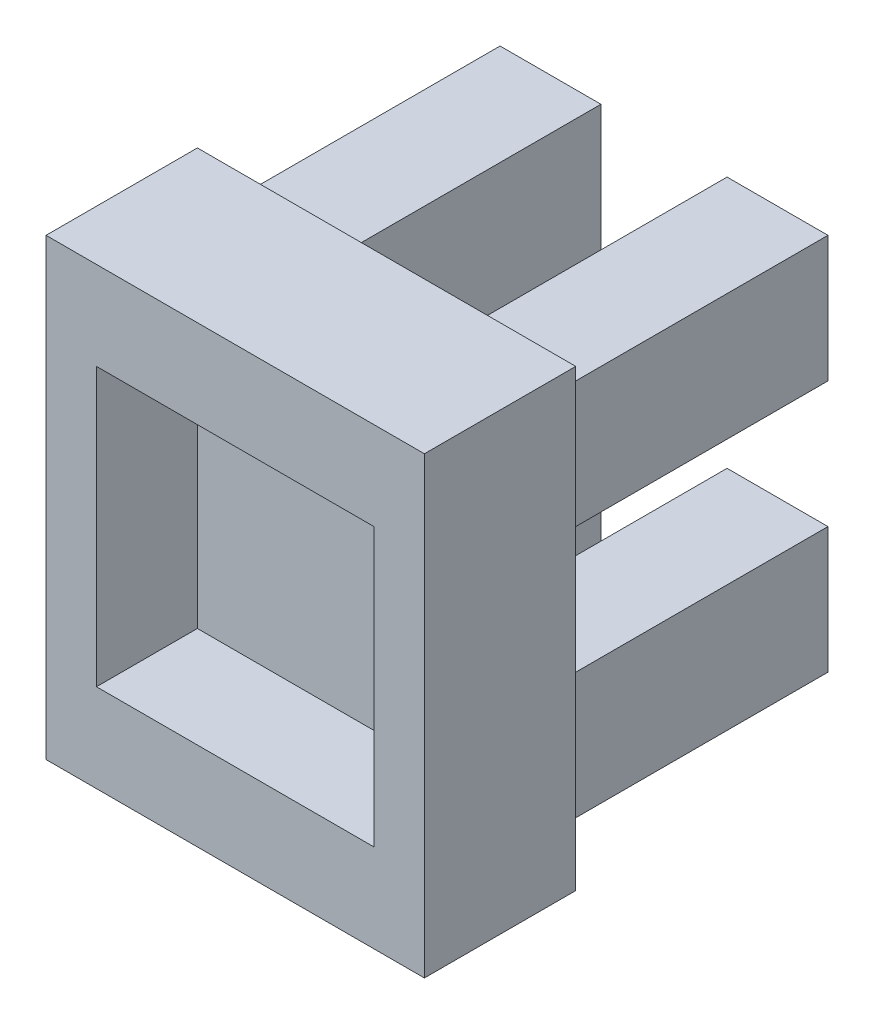
ISO-10303-21;
HEADER;
FILE_DESCRIPTION(('STEP AP214'),'2;1');
FILE_NAME('part.step','',(''),(''),'','','');
FILE_SCHEMA(('AUTOMOTIVE_DESIGN { 1 0 10303 214 1 1 1 1 }'));
ENDSEC;
DATA;
#1=APPLICATION_CONTEXT('core data for automotive mechanical design processes');
#2=APPLICATION_PROTOCOL_DEFINITION('international standard','automotive_design',2000,#1);
#3=PRODUCT_CONTEXT('',#1,'mechanical');
#4=PRODUCT('Part','Part','',(#3));
#5=PRODUCT_RELATED_PRODUCT_CATEGORY('part','',(#4));
#6=PRODUCT_DEFINITION_FORMATION('','',#4);
#7=PRODUCT_DEFINITION_CONTEXT('part definition',#1,'design');
#8=PRODUCT_DEFINITION('design','',#6,#7);
#9=PRODUCT_DEFINITION_SHAPE('','',#8);
#10=(LENGTH_UNIT() NAMED_UNIT(*) SI_UNIT(.MILLI.,.METRE.));
#11=(NAMED_UNIT(*) PLANE_ANGLE_UNIT() SI_UNIT($,.RADIAN.));
#12=(NAMED_UNIT(*) SI_UNIT($,.STERADIAN.) SOLID_ANGLE_UNIT());
#13=UNCERTAINTY_MEASURE_WITH_UNIT(LENGTH_MEASURE(1.E-05),#10,'distance_accuracy_value','');
#14=(GEOMETRIC_REPRESENTATION_CONTEXT(3) GLOBAL_UNCERTAINTY_ASSIGNED_CONTEXT((#13)) GLOBAL_UNIT_ASSIGNED_CONTEXT((#10,
#11,#12)) REPRESENTATION_CONTEXT('',''));
#15=CARTESIAN_POINT('',(0.,0.,0.));
#16=DIRECTION('',(0.,0.,1.));
#17=DIRECTION('',(1.,0.,0.));
#18=AXIS2_PLACEMENT_3D('',#15,#16,#17);
#19=CARTESIAN_POINT('',(0.,0.,0.));
#20=DIRECTION('',(0.,0.,-1.));
#21=DIRECTION('',(-1.,0.,0.));
#22=AXIS2_PLACEMENT_3D('',#19,#20,#21);
#23=PLANE('',#22);
#24=DIRECTION('',(0.,-1.,0.));
#25=VECTOR('',#24,1.);
#26=CARTESIAN_POINT('',(0.,0.,0.));
#27=LINE('',#26,#25);
#28=CARTESIAN_POINT('',(0.,18.,0.));
#29=VERTEX_POINT('',#28);
#30=CARTESIAN_POINT('',(0.,0.,0.));
#31=VERTEX_POINT('',#30);
#32=EDGE_CURVE('E391',#29,#31,#27,.T.);
#33=ORIENTED_EDGE('',*,*,#32,.F.);
#34=DIRECTION('',(-1.,0.,0.));
#35=VECTOR('',#34,1.);
#36=CARTESIAN_POINT('',(0.,18.,0.));
#37=LINE('',#36,#35);
#38=CARTESIAN_POINT('',(15.,18.,0.));
#39=VERTEX_POINT('',#38);
#40=EDGE_CURVE('E406',#39,#29,#37,.T.);
#41=ORIENTED_EDGE('',*,*,#40,.F.);
#42=DIRECTION('',(0.,1.,0.));
#43=VECTOR('',#42,1.);
#44=CARTESIAN_POINT('',(15.,0.,0.));
#45=LINE('',#44,#43);
#46=CARTESIAN_POINT('',(15.,0.,0.));
#47=VERTEX_POINT('',#46);
#48=EDGE_CURVE('E422',#47,#39,#45,.T.);
#49=ORIENTED_EDGE('',*,*,#48,.F.);
#50=DIRECTION('',(1.,0.,0.));
#51=VECTOR('',#50,1.);
#52=CARTESIAN_POINT('',(0.,0.,0.));
#53=LINE('',#52,#51);
#54=EDGE_CURVE('E419',#31,#47,#53,.T.);
#55=ORIENTED_EDGE('',*,*,#54,.F.);
#56=EDGE_LOOP('',(#33,#41,#49,#55));
#57=FACE_BOUND('',#56,.T.);
#58=DIRECTION('',(-1.,0.,0.));
#59=VECTOR('',#58,1.);
#60=CARTESIAN_POINT('',(14.,11.5,0.));
#61=LINE('',#60,#59);
#62=CARTESIAN_POINT('',(14.,11.5,0.));
#63=VERTEX_POINT('',#62);
#64=CARTESIAN_POINT('',(10.,11.5,0.));
#65=VERTEX_POINT('',#64);
#66=EDGE_CURVE('E334',#63,#65,#61,.T.);
#67=ORIENTED_EDGE('',*,*,#66,.F.);
#68=DIRECTION('',(0.,-1.,0.));
#69=VECTOR('',#68,1.);
#70=CARTESIAN_POINT('',(14.,16.5,0.));
#71=LINE('',#70,#69);
#72=CARTESIAN_POINT('',(14.,16.5,0.));
#73=VERTEX_POINT('',#72);
#74=EDGE_CURVE('E315',#73,#63,#71,.T.);
#75=ORIENTED_EDGE('',*,*,#74,.F.);
#76=DIRECTION('',(1.,0.,0.));
#77=VECTOR('',#76,1.);
#78=CARTESIAN_POINT('',(14.,16.5,0.));
#79=LINE('',#78,#77);
#80=CARTESIAN_POINT('',(10.,16.5,0.));
#81=VERTEX_POINT('',#80);
#82=EDGE_CURVE('E321',#81,#73,#79,.T.);
#83=ORIENTED_EDGE('',*,*,#82,.F.);
#84=DIRECTION('',(0.,1.,0.));
#85=VECTOR('',#84,1.);
#86=CARTESIAN_POINT('',(10.,16.5,0.));
#87=LINE('',#86,#85);
#88=EDGE_CURVE('E337',#65,#81,#87,.T.);
#89=ORIENTED_EDGE('',*,*,#88,.F.);
#90=EDGE_LOOP('',(#67,#75,#83,#89));
#91=FACE_BOUND('',#90,.T.);
#92=DIRECTION('',(-1.,0.,0.));
#93=VECTOR('',#92,1.);
#94=CARTESIAN_POINT('',(5.,11.5,0.));
#95=LINE('',#94,#93);
#96=CARTESIAN_POINT('',(5.,11.5,0.));
#97=VERTEX_POINT('',#96);
#98=CARTESIAN_POINT('',(0.999999999999999,11.5,0.));
#99=VERTEX_POINT('',#98);
#100=EDGE_CURVE('E293',#97,#99,#95,.T.);
#101=ORIENTED_EDGE('',*,*,#100,.F.);
#102=DIRECTION('',(0.,-1.,0.));
#103=VECTOR('',#102,1.);
#104=CARTESIAN_POINT('',(5.,16.5,0.));
#105=LINE('',#104,#103);
#106=CARTESIAN_POINT('',(5.,16.5,0.));
#107=VERTEX_POINT('',#106);
#108=EDGE_CURVE('E274',#107,#97,#105,.T.);
#109=ORIENTED_EDGE('',*,*,#108,.F.);
#110=DIRECTION('',(1.,0.,0.));
#111=VECTOR('',#110,1.);
#112=CARTESIAN_POINT('',(5.,16.5,0.));
#113=LINE('',#112,#111);
#114=CARTESIAN_POINT('',(1.,16.5,0.));
#115=VERTEX_POINT('',#114);
#116=EDGE_CURVE('E280',#115,#107,#113,.T.);
#117=ORIENTED_EDGE('',*,*,#116,.F.);
#118=DIRECTION('',(0.,1.,0.));
#119=VECTOR('',#118,1.);
#120=CARTESIAN_POINT('',(1.,16.5,0.));
#121=LINE('',#120,#119);
#122=EDGE_CURVE('E296',#99,#115,#121,.T.);
#123=ORIENTED_EDGE('',*,*,#122,.F.);
#124=EDGE_LOOP('',(#101,#109,#117,#123));
#125=FACE_BOUND('',#124,.T.);
#126=DIRECTION('',(-1.,0.,0.));
#127=VECTOR('',#126,1.);
#128=CARTESIAN_POINT('',(14.,1.5,0.));
#129=LINE('',#128,#127);
#130=CARTESIAN_POINT('',(14.,1.5,0.));
#131=VERTEX_POINT('',#130);
#132=CARTESIAN_POINT('',(10.,1.5,0.));
#133=VERTEX_POINT('',#132);
#134=EDGE_CURVE('E235',#131,#133,#129,.T.);
#135=ORIENTED_EDGE('',*,*,#134,.F.);
#136=DIRECTION('',(0.,-1.,0.));
#137=VECTOR('',#136,1.);
#138=CARTESIAN_POINT('',(14.,6.5,0.));
#139=LINE('',#138,#137);
#140=CARTESIAN_POINT('',(14.,6.5,0.));
#141=VERTEX_POINT('',#140);
#142=EDGE_CURVE('E230',#141,#131,#139,.T.);
#143=ORIENTED_EDGE('',*,*,#142,.F.);
#144=DIRECTION('',(1.,0.,0.));
#145=VECTOR('',#144,1.);
#146=CARTESIAN_POINT('',(14.,6.5,0.));
#147=LINE('',#146,#145);
#148=CARTESIAN_POINT('',(10.,6.5,0.));
#149=VERTEX_POINT('',#148);
#150=EDGE_CURVE('E245',#149,#141,#147,.T.);
#151=ORIENTED_EDGE('',*,*,#150,.F.);
#152=DIRECTION('',(0.,1.,0.));
#153=VECTOR('',#152,1.);
#154=CARTESIAN_POINT('',(10.,6.5,0.));
#155=LINE('',#154,#153);
#156=EDGE_CURVE('E257',#133,#149,#155,.T.);
#157=ORIENTED_EDGE('',*,*,#156,.F.);
#158=EDGE_LOOP('',(#135,#143,#151,#157));
#159=FACE_BOUND('',#158,.T.);
#160=DIRECTION('',(-1.,0.,0.));
#161=VECTOR('',#160,1.);
#162=CARTESIAN_POINT('',(5.,1.5,0.));
#163=LINE('',#162,#161);
#164=CARTESIAN_POINT('',(5.,1.5,0.));
#165=VERTEX_POINT('',#164);
#166=CARTESIAN_POINT('',(0.999999999999997,1.5,0.));
#167=VERTEX_POINT('',#166);
#168=EDGE_CURVE('E726',#165,#167,#163,.T.);
#169=ORIENTED_EDGE('',*,*,#168,.F.);
#170=DIRECTION('',(0.,-1.,0.));
#171=VECTOR('',#170,1.);
#172=CARTESIAN_POINT('',(5.,6.5,0.));
#173=LINE('',#172,#171);
#174=CARTESIAN_POINT('',(5.,6.5,0.));
#175=VERTEX_POINT('',#174);
#176=EDGE_CURVE('E227',#175,#165,#173,.T.);
#177=ORIENTED_EDGE('',*,*,#176,.F.);
#178=DIRECTION('',(1.,0.,0.));
#179=VECTOR('',#178,1.);
#180=CARTESIAN_POINT('',(5.,6.5,0.));
#181=LINE('',#180,#179);
#182=CARTESIAN_POINT('',(0.999999999999998,6.5,0.));
#183=VERTEX_POINT('',#182);
#184=EDGE_CURVE('E223',#183,#175,#181,.T.);
#185=ORIENTED_EDGE('',*,*,#184,.F.);
#186=DIRECTION('',(0.,1.,0.));
#187=VECTOR('',#186,1.);
#188=CARTESIAN_POINT('',(0.999999999999998,6.5,0.));
#189=LINE('',#188,#187);
#190=EDGE_CURVE('E722',#167,#183,#189,.T.);
#191=ORIENTED_EDGE('',*,*,#190,.F.);
#192=EDGE_LOOP('',(#169,#177,#185,#191));
#193=FACE_BOUND('',#192,.T.);
#194=ADVANCED_FACE('F39',(#57,#91,#125,#159,#193),#23,.T.);
#195=CARTESIAN_POINT('',(0.,0.,6.));
#196=DIRECTION('',(1.,0.,0.));
#197=DIRECTION('',(0.,0.,-1.));
#198=AXIS2_PLACEMENT_3D('',#195,#196,#197);
#199=PLANE('',#198);
#200=ORIENTED_EDGE('',*,*,#32,.T.);
#201=DIRECTION('',(0.,0.,-1.));
#202=VECTOR('',#201,1.);
#203=CARTESIAN_POINT('',(0.,0.,6.));
#204=LINE('',#203,#202);
#205=CARTESIAN_POINT('',(0.,0.,6.));
#206=VERTEX_POINT('',#205);
#207=EDGE_CURVE('E11',#206,#31,#204,.T.);
#208=ORIENTED_EDGE('',*,*,#207,.F.);
#209=DIRECTION('',(0.,-1.,0.));
#210=VECTOR('',#209,1.);
#211=CARTESIAN_POINT('',(0.,0.,6.));
#212=LINE('',#211,#210);
#213=CARTESIAN_POINT('',(0.,18.,6.));
#214=VERTEX_POINT('',#213);
#215=EDGE_CURVE('E401',#214,#206,#212,.T.);
#216=ORIENTED_EDGE('',*,*,#215,.F.);
#217=DIRECTION('',(0.,0.,-1.));
#218=VECTOR('',#217,1.);
#219=CARTESIAN_POINT('',(0.,18.,6.));
#220=LINE('',#219,#218);
#221=EDGE_CURVE('E415',#214,#29,#220,.T.);
#222=ORIENTED_EDGE('',*,*,#221,.T.);
#223=EDGE_LOOP('',(#200,#208,#216,#222));
#224=FACE_BOUND('',#223,.T.);
#225=ADVANCED_FACE('F41',(#224),#199,.F.);
#226=CARTESIAN_POINT('',(0.,0.,6.));
#227=DIRECTION('',(0.,1.,0.));
#228=DIRECTION('',(0.,0.,1.));
#229=AXIS2_PLACEMENT_3D('',#226,#227,#228);
#230=PLANE('',#229);
#231=ORIENTED_EDGE('',*,*,#54,.T.);
#232=DIRECTION('',(0.,0.,-1.));
#233=VECTOR('',#232,1.);
#234=CARTESIAN_POINT('',(15.,0.,6.));
#235=LINE('',#234,#233);
#236=CARTESIAN_POINT('',(15.,0.,6.));
#237=VERTEX_POINT('',#236);
#238=EDGE_CURVE('E48',#237,#47,#235,.T.);
#239=ORIENTED_EDGE('',*,*,#238,.F.);
#240=DIRECTION('',(1.,0.,0.));
#241=VECTOR('',#240,1.);
#242=CARTESIAN_POINT('',(0.,0.,6.));
#243=LINE('',#242,#241);
#244=EDGE_CURVE('E405',#206,#237,#243,.T.);
#245=ORIENTED_EDGE('',*,*,#244,.F.);
#246=ORIENTED_EDGE('',*,*,#207,.T.);
#247=EDGE_LOOP('',(#231,#239,#245,#246));
#248=FACE_BOUND('',#247,.T.);
#249=ADVANCED_FACE('F455',(#248),#230,.F.);
#250=CARTESIAN_POINT('',(15.,0.,6.));
#251=DIRECTION('',(-1.,0.,0.));
#252=DIRECTION('',(0.,0.,1.));
#253=AXIS2_PLACEMENT_3D('',#250,#251,#252);
#254=PLANE('',#253);
#255=ORIENTED_EDGE('',*,*,#48,.T.);
#256=DIRECTION('',(0.,0.,-1.));
#257=VECTOR('',#256,1.);
#258=CARTESIAN_POINT('',(15.,18.,6.));
#259=LINE('',#258,#257);
#260=CARTESIAN_POINT('',(15.,18.,6.));
#261=VERTEX_POINT('',#260);
#262=EDGE_CURVE('E430',#261,#39,#259,.T.);
#263=ORIENTED_EDGE('',*,*,#262,.F.);
#264=DIRECTION('',(0.,1.,0.));
#265=VECTOR('',#264,1.);
#266=CARTESIAN_POINT('',(15.,0.,6.));
#267=LINE('',#266,#265);
#268=EDGE_CURVE('E409',#237,#261,#267,.T.);
#269=ORIENTED_EDGE('',*,*,#268,.F.);
#270=ORIENTED_EDGE('',*,*,#238,.T.);
#271=EDGE_LOOP('',(#255,#263,#269,#270));
#272=FACE_BOUND('',#271,.T.);
#273=ADVANCED_FACE('F439',(#272),#254,.F.);
#274=CARTESIAN_POINT('',(0.,18.,6.));
#275=DIRECTION('',(0.,-1.,0.));
#276=DIRECTION('',(0.,0.,-1.));
#277=AXIS2_PLACEMENT_3D('',#274,#275,#276);
#278=PLANE('',#277);
#279=ORIENTED_EDGE('',*,*,#40,.T.);
#280=ORIENTED_EDGE('',*,*,#221,.F.);
#281=DIRECTION('',(-1.,0.,0.));
#282=VECTOR('',#281,1.);
#283=CARTESIAN_POINT('',(0.,18.,6.));
#284=LINE('',#283,#282);
#285=EDGE_CURVE('E412',#261,#214,#284,.T.);
#286=ORIENTED_EDGE('',*,*,#285,.F.);
#287=ORIENTED_EDGE('',*,*,#262,.T.);
#288=EDGE_LOOP('',(#279,#280,#286,#287));
#289=FACE_BOUND('',#288,.T.);
#290=ADVANCED_FACE('F448',(#289),#278,.F.);
#291=CARTESIAN_POINT('',(0.,0.,6.));
#292=DIRECTION('',(0.,0.,-1.));
#293=DIRECTION('',(-1.,0.,0.));
#294=AXIS2_PLACEMENT_3D('',#291,#292,#293);
#295=PLANE('',#294);
#296=DIRECTION('',(1.,0.,0.));
#297=VECTOR('',#296,1.);
#298=CARTESIAN_POINT('',(2.,3.5,6.));
#299=LINE('',#298,#297);
#300=CARTESIAN_POINT('',(2.,3.5,6.));
#301=VERTEX_POINT('',#300);
#302=CARTESIAN_POINT('',(13.,3.5,6.));
#303=VERTEX_POINT('',#302);
#304=EDGE_CURVE('E377',#301,#303,#299,.T.);
#305=ORIENTED_EDGE('',*,*,#304,.F.);
#306=DIRECTION('',(0.,-1.,0.));
#307=VECTOR('',#306,1.);
#308=CARTESIAN_POINT('',(2.,14.5,6.));
#309=LINE('',#308,#307);
#310=CARTESIAN_POINT('',(2.,14.5,6.));
#311=VERTEX_POINT('',#310);
#312=EDGE_CURVE('E356',#311,#301,#309,.T.);
#313=ORIENTED_EDGE('',*,*,#312,.F.);
#314=DIRECTION('',(-1.,0.,0.));
#315=VECTOR('',#314,1.);
#316=CARTESIAN_POINT('',(2.,14.5,6.));
#317=LINE('',#316,#315);
#318=CARTESIAN_POINT('',(13.,14.5,6.));
#319=VERTEX_POINT('',#318);
#320=EDGE_CURVE('E362',#319,#311,#317,.T.);
#321=ORIENTED_EDGE('',*,*,#320,.F.);
#322=DIRECTION('',(0.,1.,0.));
#323=VECTOR('',#322,1.);
#324=CARTESIAN_POINT('',(13.,14.5,6.));
#325=LINE('',#324,#323);
#326=EDGE_CURVE('E381',#303,#319,#325,.T.);
#327=ORIENTED_EDGE('',*,*,#326,.F.);
#328=EDGE_LOOP('',(#305,#313,#321,#327));
#329=FACE_BOUND('',#328,.T.);
#330=ORIENTED_EDGE('',*,*,#215,.T.);
#331=ORIENTED_EDGE('',*,*,#244,.T.);
#332=ORIENTED_EDGE('',*,*,#268,.T.);
#333=ORIENTED_EDGE('',*,*,#285,.T.);
#334=EDGE_LOOP('',(#330,#331,#332,#333));
#335=FACE_BOUND('',#334,.T.);
#336=ADVANCED_FACE('F454',(#329,#335),#295,.F.);
#337=CARTESIAN_POINT('',(2.,14.5,2.));
#338=DIRECTION('',(-1.,0.,0.));
#339=DIRECTION('',(0.,-1.,0.));
#340=AXIS2_PLACEMENT_3D('',#337,#338,#339);
#341=PLANE('',#340);
#342=ORIENTED_EDGE('',*,*,#312,.T.);
#343=DIRECTION('',(0.,0.,1.));
#344=VECTOR('',#343,1.);
#345=CARTESIAN_POINT('',(2.,3.5,2.));
#346=LINE('',#345,#344);
#347=CARTESIAN_POINT('',(2.,3.5,2.));
#348=VERTEX_POINT('',#347);
#349=EDGE_CURVE('E374',#348,#301,#346,.T.);
#350=ORIENTED_EDGE('',*,*,#349,.F.);
#351=DIRECTION('',(0.,-1.,0.));
#352=VECTOR('',#351,1.);
#353=CARTESIAN_POINT('',(2.,14.5,2.));
#354=LINE('',#353,#352);
#355=CARTESIAN_POINT('',(2.,14.5,2.));
#356=VERTEX_POINT('',#355);
#357=EDGE_CURVE('E357',#356,#348,#354,.T.);
#358=ORIENTED_EDGE('',*,*,#357,.F.);
#359=DIRECTION('',(0.,0.,1.));
#360=VECTOR('',#359,1.);
#361=CARTESIAN_POINT('',(2.,14.5,2.));
#362=LINE('',#361,#360);
#363=EDGE_CURVE('E388',#356,#311,#362,.T.);
#364=ORIENTED_EDGE('',*,*,#363,.T.);
#365=EDGE_LOOP('',(#342,#350,#358,#364));
#366=FACE_BOUND('',#365,.T.);
#367=ADVANCED_FACE('F473',(#366),#341,.F.);
#368=CARTESIAN_POINT('',(2.,14.5,2.));
#369=DIRECTION('',(0.,1.,0.));
#370=DIRECTION('',(0.,0.,1.));
#371=AXIS2_PLACEMENT_3D('',#368,#369,#370);
#372=PLANE('',#371);
#373=ORIENTED_EDGE('',*,*,#320,.T.);
#374=ORIENTED_EDGE('',*,*,#363,.F.);
#375=DIRECTION('',(-1.,0.,0.));
#376=VECTOR('',#375,1.);
#377=CARTESIAN_POINT('',(2.,14.5,2.));
#378=LINE('',#377,#376);
#379=CARTESIAN_POINT('',(13.,14.5,2.));
#380=VERTEX_POINT('',#379);
#381=EDGE_CURVE('E370',#380,#356,#378,.T.);
#382=ORIENTED_EDGE('',*,*,#381,.F.);
#383=DIRECTION('',(0.,0.,1.));
#384=VECTOR('',#383,1.);
#385=CARTESIAN_POINT('',(13.,14.5,2.));
#386=LINE('',#385,#384);
#387=EDGE_CURVE('E392',#380,#319,#386,.T.);
#388=ORIENTED_EDGE('',*,*,#387,.T.);
#389=EDGE_LOOP('',(#373,#374,#382,#388));
#390=FACE_BOUND('',#389,.T.);
#391=ADVANCED_FACE('F478',(#390),#372,.F.);
#392=CARTESIAN_POINT('',(13.,14.5,2.));
#393=DIRECTION('',(1.,0.,0.));
#394=DIRECTION('',(0.,1.,0.));
#395=AXIS2_PLACEMENT_3D('',#392,#393,#394);
#396=PLANE('',#395);
#397=ORIENTED_EDGE('',*,*,#326,.T.);
#398=ORIENTED_EDGE('',*,*,#387,.F.);
#399=DIRECTION('',(0.,1.,0.));
#400=VECTOR('',#399,1.);
#401=CARTESIAN_POINT('',(13.,14.5,2.));
#402=LINE('',#401,#400);
#403=CARTESIAN_POINT('',(13.,3.5,2.));
#404=VERTEX_POINT('',#403);
#405=EDGE_CURVE('E366',#404,#380,#402,.T.);
#406=ORIENTED_EDGE('',*,*,#405,.F.);
#407=DIRECTION('',(0.,0.,1.));
#408=VECTOR('',#407,1.);
#409=CARTESIAN_POINT('',(13.,3.5,2.));
#410=LINE('',#409,#408);
#411=EDGE_CURVE('E395',#404,#303,#410,.T.);
#412=ORIENTED_EDGE('',*,*,#411,.T.);
#413=EDGE_LOOP('',(#397,#398,#406,#412));
#414=FACE_BOUND('',#413,.T.);
#415=ADVANCED_FACE('F492',(#414),#396,.F.);
#416=CARTESIAN_POINT('',(2.,3.5,2.));
#417=DIRECTION('',(0.,-1.,0.));
#418=DIRECTION('',(0.,0.,-1.));
#419=AXIS2_PLACEMENT_3D('',#416,#417,#418);
#420=PLANE('',#419);
#421=ORIENTED_EDGE('',*,*,#304,.T.);
#422=ORIENTED_EDGE('',*,*,#411,.F.);
#423=DIRECTION('',(1.,0.,0.));
#424=VECTOR('',#423,1.);
#425=CARTESIAN_POINT('',(2.,3.5,2.));
#426=LINE('',#425,#424);
#427=EDGE_CURVE('E361',#348,#404,#426,.T.);
#428=ORIENTED_EDGE('',*,*,#427,.F.);
#429=ORIENTED_EDGE('',*,*,#349,.T.);
#430=EDGE_LOOP('',(#421,#422,#428,#429));
#431=FACE_BOUND('',#430,.T.);
#432=ADVANCED_FACE('F485',(#431),#420,.F.);
#433=CARTESIAN_POINT('',(0.,0.,2.));
#434=DIRECTION('',(0.,0.,1.));
#435=DIRECTION('',(1.,0.,0.));
#436=AXIS2_PLACEMENT_3D('',#433,#434,#435);
#437=PLANE('',#436);
#438=ORIENTED_EDGE('',*,*,#357,.T.);
#439=ORIENTED_EDGE('',*,*,#427,.T.);
#440=ORIENTED_EDGE('',*,*,#405,.T.);
#441=ORIENTED_EDGE('',*,*,#381,.T.);
#442=EDGE_LOOP('',(#438,#439,#440,#441));
#443=FACE_BOUND('',#442,.T.);
#444=ADVANCED_FACE('F494',(#443),#437,.T.);
#445=CARTESIAN_POINT('',(14.,16.5,-11.));
#446=DIRECTION('',(-1.,0.,0.));
#447=DIRECTION('',(0.,0.,1.));
#448=AXIS2_PLACEMENT_3D('',#445,#446,#447);
#449=PLANE('',#448);
#450=ORIENTED_EDGE('',*,*,#74,.T.);
#451=DIRECTION('',(0.,0.,1.));
#452=VECTOR('',#451,1.);
#453=CARTESIAN_POINT('',(14.,11.5,-11.));
#454=LINE('',#453,#452);
#455=CARTESIAN_POINT('',(14.,11.5,-11.));
#456=VERTEX_POINT('',#455);
#457=EDGE_CURVE('E353',#456,#63,#454,.T.);
#458=ORIENTED_EDGE('',*,*,#457,.F.);
#459=DIRECTION('',(0.,-1.,0.));
#460=VECTOR('',#459,1.);
#461=CARTESIAN_POINT('',(14.,16.5,-11.));
#462=LINE('',#461,#460);
#463=CARTESIAN_POINT('',(14.,16.5,-11.));
#464=VERTEX_POINT('',#463);
#465=EDGE_CURVE('E316',#464,#456,#462,.T.);
#466=ORIENTED_EDGE('',*,*,#465,.F.);
#467=DIRECTION('',(0.,0.,1.));
#468=VECTOR('',#467,1.);
#469=CARTESIAN_POINT('',(14.,16.5,-11.));
#470=LINE('',#469,#468);
#471=EDGE_CURVE('E330',#464,#73,#470,.T.);
#472=ORIENTED_EDGE('',*,*,#471,.T.);
#473=EDGE_LOOP('',(#450,#458,#466,#472));
#474=FACE_BOUND('',#473,.T.);
#475=ADVANCED_FACE('F496',(#474),#449,.F.);
#476=CARTESIAN_POINT('',(14.,11.5,-11.));
#477=DIRECTION('',(0.,1.,0.));
#478=DIRECTION('',(0.,0.,1.));
#479=AXIS2_PLACEMENT_3D('',#476,#477,#478);
#480=PLANE('',#479);
#481=ORIENTED_EDGE('',*,*,#66,.T.);
#482=DIRECTION('',(0.,0.,1.));
#483=VECTOR('',#482,1.);
#484=CARTESIAN_POINT('',(10.,11.5,-11.));
#485=LINE('',#484,#483);
#486=CARTESIAN_POINT('',(10.,11.5,-11.));
#487=VERTEX_POINT('',#486);
#488=EDGE_CURVE('E349',#487,#65,#485,.T.);
#489=ORIENTED_EDGE('',*,*,#488,.F.);
#490=DIRECTION('',(-1.,0.,0.));
#491=VECTOR('',#490,1.);
#492=CARTESIAN_POINT('',(14.,11.5,-11.));
#493=LINE('',#492,#491);
#494=EDGE_CURVE('E320',#456,#487,#493,.T.);
#495=ORIENTED_EDGE('',*,*,#494,.F.);
#496=ORIENTED_EDGE('',*,*,#457,.T.);
#497=EDGE_LOOP('',(#481,#489,#495,#496));
#498=FACE_BOUND('',#497,.T.);
#499=ADVANCED_FACE('F502',(#498),#480,.F.);
#500=CARTESIAN_POINT('',(10.,16.5,-11.));
#501=DIRECTION('',(1.,0.,0.));
#502=DIRECTION('',(0.,1.,0.));
#503=AXIS2_PLACEMENT_3D('',#500,#501,#502);
#504=PLANE('',#503);
#505=ORIENTED_EDGE('',*,*,#88,.T.);
#506=DIRECTION('',(0.,0.,1.));
#507=VECTOR('',#506,1.);
#508=CARTESIAN_POINT('',(10.,16.5,-11.));
#509=LINE('',#508,#507);
#510=CARTESIAN_POINT('',(10.,16.5,-11.));
#511=VERTEX_POINT('',#510);
#512=EDGE_CURVE('E346',#511,#81,#509,.T.);
#513=ORIENTED_EDGE('',*,*,#512,.F.);
#514=DIRECTION('',(0.,1.,0.));
#515=VECTOR('',#514,1.);
#516=CARTESIAN_POINT('',(10.,16.5,-11.));
#517=LINE('',#516,#515);
#518=EDGE_CURVE('E324',#487,#511,#517,.T.);
#519=ORIENTED_EDGE('',*,*,#518,.F.);
#520=ORIENTED_EDGE('',*,*,#488,.T.);
#521=EDGE_LOOP('',(#505,#513,#519,#520));
#522=FACE_BOUND('',#521,.T.);
#523=ADVANCED_FACE('F542',(#522),#504,.F.);
#524=CARTESIAN_POINT('',(14.,16.5,-11.));
#525=DIRECTION('',(0.,-1.,0.));
#526=DIRECTION('',(0.,0.,-1.));
#527=AXIS2_PLACEMENT_3D('',#524,#525,#526);
#528=PLANE('',#527);
#529=ORIENTED_EDGE('',*,*,#82,.T.);
#530=ORIENTED_EDGE('',*,*,#471,.F.);
#531=DIRECTION('',(1.,0.,0.));
#532=VECTOR('',#531,1.);
#533=CARTESIAN_POINT('',(14.,16.5,-11.));
#534=LINE('',#533,#532);
#535=EDGE_CURVE('E327',#511,#464,#534,.T.);
#536=ORIENTED_EDGE('',*,*,#535,.F.);
#537=ORIENTED_EDGE('',*,*,#512,.T.);
#538=EDGE_LOOP('',(#529,#530,#536,#537));
#539=FACE_BOUND('',#538,.T.);
#540=ADVANCED_FACE('F551',(#539),#528,.F.);
#541=CARTESIAN_POINT('',(0.,0.,-11.));
#542=DIRECTION('',(0.,0.,-1.));
#543=DIRECTION('',(-1.,0.,0.));
#544=AXIS2_PLACEMENT_3D('',#541,#542,#543);
#545=PLANE('',#544);
#546=ORIENTED_EDGE('',*,*,#465,.T.);
#547=ORIENTED_EDGE('',*,*,#494,.T.);
#548=ORIENTED_EDGE('',*,*,#518,.T.);
#549=ORIENTED_EDGE('',*,*,#535,.T.);
#550=EDGE_LOOP('',(#546,#547,#548,#549));
#551=FACE_BOUND('',#550,.T.);
#552=ADVANCED_FACE('F561',(#551),#545,.T.);
#553=CARTESIAN_POINT('',(5.,16.5,-11.));
#554=DIRECTION('',(-1.,0.,0.));
#555=DIRECTION('',(0.,-1.,0.));
#556=AXIS2_PLACEMENT_3D('',#553,#554,#555);
#557=PLANE('',#556);
#558=ORIENTED_EDGE('',*,*,#108,.T.);
#559=DIRECTION('',(0.,0.,1.));
#560=VECTOR('',#559,1.);
#561=CARTESIAN_POINT('',(5.,11.5,-11.));
#562=LINE('',#561,#560);
#563=CARTESIAN_POINT('',(5.,11.5,-11.));
#564=VERTEX_POINT('',#563);
#565=EDGE_CURVE('E312',#564,#97,#562,.T.);
#566=ORIENTED_EDGE('',*,*,#565,.F.);
#567=DIRECTION('',(0.,-1.,0.));
#568=VECTOR('',#567,1.);
#569=CARTESIAN_POINT('',(5.,16.5,-11.));
#570=LINE('',#569,#568);
#571=CARTESIAN_POINT('',(5.,16.5,-11.));
#572=VERTEX_POINT('',#571);
#573=EDGE_CURVE('E275',#572,#564,#570,.T.);
#574=ORIENTED_EDGE('',*,*,#573,.F.);
#575=DIRECTION('',(0.,0.,1.));
#576=VECTOR('',#575,1.);
#577=CARTESIAN_POINT('',(5.,16.5,-11.));
#578=LINE('',#577,#576);
#579=EDGE_CURVE('E289',#572,#107,#578,.T.);
#580=ORIENTED_EDGE('',*,*,#579,.T.);
#581=EDGE_LOOP('',(#558,#566,#574,#580));
#582=FACE_BOUND('',#581,.T.);
#583=ADVANCED_FACE('F571',(#582),#557,.F.);
#584=CARTESIAN_POINT('',(5.,11.5,-11.));
#585=DIRECTION('',(0.,1.,0.));
#586=DIRECTION('',(-1.,0.,0.));
#587=AXIS2_PLACEMENT_3D('',#584,#585,#586);
#588=PLANE('',#587);
#589=ORIENTED_EDGE('',*,*,#100,.T.);
#590=DIRECTION('',(0.,0.,1.));
#591=VECTOR('',#590,1.);
#592=CARTESIAN_POINT('',(0.999999999999999,11.5,-11.));
#593=LINE('',#592,#591);
#594=CARTESIAN_POINT('',(0.999999999999999,11.5,-11.));
#595=VERTEX_POINT('',#594);
#596=EDGE_CURVE('E308',#595,#99,#593,.T.);
#597=ORIENTED_EDGE('',*,*,#596,.F.);
#598=DIRECTION('',(-1.,0.,0.));
#599=VECTOR('',#598,1.);
#600=CARTESIAN_POINT('',(5.,11.5,-11.));
#601=LINE('',#600,#599);
#602=EDGE_CURVE('E279',#564,#595,#601,.T.);
#603=ORIENTED_EDGE('',*,*,#602,.F.);
#604=ORIENTED_EDGE('',*,*,#565,.T.);
#605=EDGE_LOOP('',(#589,#597,#603,#604));
#606=FACE_BOUND('',#605,.T.);
#607=ADVANCED_FACE('F581',(#606),#588,.F.);
#608=CARTESIAN_POINT('',(1.,16.5,-11.));
#609=DIRECTION('',(1.,0.,0.));
#610=DIRECTION('',(0.,1.,0.));
#611=AXIS2_PLACEMENT_3D('',#608,#609,#610);
#612=PLANE('',#611);
#613=ORIENTED_EDGE('',*,*,#122,.T.);
#614=DIRECTION('',(0.,0.,1.));
#615=VECTOR('',#614,1.);
#616=CARTESIAN_POINT('',(1.,16.5,-11.));
#617=LINE('',#616,#615);
#618=CARTESIAN_POINT('',(1.,16.5,-11.));
#619=VERTEX_POINT('',#618);
#620=EDGE_CURVE('E305',#619,#115,#617,.T.);
#621=ORIENTED_EDGE('',*,*,#620,.F.);
#622=DIRECTION('',(0.,1.,0.));
#623=VECTOR('',#622,1.);
#624=CARTESIAN_POINT('',(1.,16.5,-11.));
#625=LINE('',#624,#623);
#626=EDGE_CURVE('E283',#595,#619,#625,.T.);
#627=ORIENTED_EDGE('',*,*,#626,.F.);
#628=ORIENTED_EDGE('',*,*,#596,.T.);
#629=EDGE_LOOP('',(#613,#621,#627,#628));
#630=FACE_BOUND('',#629,.T.);
#631=ADVANCED_FACE('F591',(#630),#612,.F.);
#632=CARTESIAN_POINT('',(5.,16.5,-11.));
#633=DIRECTION('',(0.,-1.,0.));
#634=DIRECTION('',(0.,0.,-1.));
#635=AXIS2_PLACEMENT_3D('',#632,#633,#634);
#636=PLANE('',#635);
#637=ORIENTED_EDGE('',*,*,#116,.T.);
#638=ORIENTED_EDGE('',*,*,#579,.F.);
#639=DIRECTION('',(1.,0.,0.));
#640=VECTOR('',#639,1.);
#641=CARTESIAN_POINT('',(5.,16.5,-11.));
#642=LINE('',#641,#640);
#643=EDGE_CURVE('E286',#619,#572,#642,.T.);
#644=ORIENTED_EDGE('',*,*,#643,.F.);
#645=ORIENTED_EDGE('',*,*,#620,.T.);
#646=EDGE_LOOP('',(#637,#638,#644,#645));
#647=FACE_BOUND('',#646,.T.);
#648=ADVANCED_FACE('F601',(#647),#636,.F.);
#649=CARTESIAN_POINT('',(0.,0.,-11.));
#650=DIRECTION('',(0.,0.,-1.));
#651=DIRECTION('',(-1.,0.,0.));
#652=AXIS2_PLACEMENT_3D('',#649,#650,#651);
#653=PLANE('',#652);
#654=ORIENTED_EDGE('',*,*,#573,.T.);
#655=ORIENTED_EDGE('',*,*,#602,.T.);
#656=ORIENTED_EDGE('',*,*,#626,.T.);
#657=ORIENTED_EDGE('',*,*,#643,.T.);
#658=EDGE_LOOP('',(#654,#655,#656,#657));
#659=FACE_BOUND('',#658,.T.);
#660=ADVANCED_FACE('F611',(#659),#653,.T.);
#661=CARTESIAN_POINT('',(14.,6.5,-11.));
#662=DIRECTION('',(-1.,0.,0.));
#663=DIRECTION('',(0.,0.,1.));
#664=AXIS2_PLACEMENT_3D('',#661,#662,#663);
#665=PLANE('',#664);
#666=ORIENTED_EDGE('',*,*,#142,.T.);
#667=DIRECTION('',(0.,0.,1.));
#668=VECTOR('',#667,1.);
#669=CARTESIAN_POINT('',(14.,1.5,-11.));
#670=LINE('',#669,#668);
#671=CARTESIAN_POINT('',(14.,1.5,-11.));
#672=VERTEX_POINT('',#671);
#673=EDGE_CURVE('E271',#672,#131,#670,.T.);
#674=ORIENTED_EDGE('',*,*,#673,.F.);
#675=DIRECTION('',(0.,-1.,0.));
#676=VECTOR('',#675,1.);
#677=CARTESIAN_POINT('',(14.,6.5,-11.));
#678=LINE('',#677,#676);
#679=CARTESIAN_POINT('',(14.,6.5,-11.));
#680=VERTEX_POINT('',#679);
#681=EDGE_CURVE('E240',#680,#672,#678,.T.);
#682=ORIENTED_EDGE('',*,*,#681,.F.);
#683=DIRECTION('',(0.,0.,1.));
#684=VECTOR('',#683,1.);
#685=CARTESIAN_POINT('',(14.,6.5,-11.));
#686=LINE('',#685,#684);
#687=EDGE_CURVE('E253',#680,#141,#686,.T.);
#688=ORIENTED_EDGE('',*,*,#687,.T.);
#689=EDGE_LOOP('',(#666,#674,#682,#688));
#690=FACE_BOUND('',#689,.T.);
#691=ADVANCED_FACE('F621',(#690),#665,.F.);
#692=CARTESIAN_POINT('',(14.,1.5,-11.));
#693=DIRECTION('',(0.,1.,0.));
#694=DIRECTION('',(-1.,0.,0.));
#695=AXIS2_PLACEMENT_3D('',#692,#693,#694);
#696=PLANE('',#695);
#697=ORIENTED_EDGE('',*,*,#134,.T.);
#698=DIRECTION('',(0.,0.,1.));
#699=VECTOR('',#698,1.);
#700=CARTESIAN_POINT('',(10.,1.5,-11.));
#701=LINE('',#700,#699);
#702=CARTESIAN_POINT('',(10.,1.5,-11.));
#703=VERTEX_POINT('',#702);
#704=EDGE_CURVE('E267',#703,#133,#701,.T.);
#705=ORIENTED_EDGE('',*,*,#704,.F.);
#706=DIRECTION('',(-1.,0.,0.));
#707=VECTOR('',#706,1.);
#708=CARTESIAN_POINT('',(14.,1.5,-11.));
#709=LINE('',#708,#707);
#710=EDGE_CURVE('E244',#672,#703,#709,.T.);
#711=ORIENTED_EDGE('',*,*,#710,.F.);
#712=ORIENTED_EDGE('',*,*,#673,.T.);
#713=EDGE_LOOP('',(#697,#705,#711,#712));
#714=FACE_BOUND('',#713,.T.);
#715=ADVANCED_FACE('F631',(#714),#696,.F.);
#716=CARTESIAN_POINT('',(10.,6.5,-11.));
#717=DIRECTION('',(1.,0.,0.));
#718=DIRECTION('',(0.,0.,-1.));
#719=AXIS2_PLACEMENT_3D('',#716,#717,#718);
#720=PLANE('',#719);
#721=ORIENTED_EDGE('',*,*,#156,.T.);
#722=DIRECTION('',(0.,0.,1.));
#723=VECTOR('',#722,1.);
#724=CARTESIAN_POINT('',(10.,6.5,-11.));
#725=LINE('',#724,#723);
#726=CARTESIAN_POINT('',(10.,6.5,-11.));
#727=VERTEX_POINT('',#726);
#728=EDGE_CURVE('E63',#727,#149,#725,.T.);
#729=ORIENTED_EDGE('',*,*,#728,.F.);
#730=DIRECTION('',(0.,1.,0.));
#731=VECTOR('',#730,1.);
#732=CARTESIAN_POINT('',(10.,6.5,-11.));
#733=LINE('',#732,#731);
#734=EDGE_CURVE('E248',#703,#727,#733,.T.);
#735=ORIENTED_EDGE('',*,*,#734,.F.);
#736=ORIENTED_EDGE('',*,*,#704,.T.);
#737=EDGE_LOOP('',(#721,#729,#735,#736));
#738=FACE_BOUND('',#737,.T.);
#739=ADVANCED_FACE('F641',(#738),#720,.F.);
#740=CARTESIAN_POINT('',(14.,6.5,-11.));
#741=DIRECTION('',(0.,-1.,0.));
#742=DIRECTION('',(0.,0.,-1.));
#743=AXIS2_PLACEMENT_3D('',#740,#741,#742);
#744=PLANE('',#743);
#745=ORIENTED_EDGE('',*,*,#150,.T.);
#746=ORIENTED_EDGE('',*,*,#687,.F.);
#747=DIRECTION('',(1.,0.,0.));
#748=VECTOR('',#747,1.);
#749=CARTESIAN_POINT('',(14.,6.5,-11.));
#750=LINE('',#749,#748);
#751=EDGE_CURVE('E251',#727,#680,#750,.T.);
#752=ORIENTED_EDGE('',*,*,#751,.F.);
#753=ORIENTED_EDGE('',*,*,#728,.T.);
#754=EDGE_LOOP('',(#745,#746,#752,#753));
#755=FACE_BOUND('',#754,.T.);
#756=ADVANCED_FACE('F651',(#755),#744,.F.);
#757=CARTESIAN_POINT('',(0.,0.,-11.));
#758=DIRECTION('',(0.,0.,-1.));
#759=DIRECTION('',(-1.,0.,0.));
#760=AXIS2_PLACEMENT_3D('',#757,#758,#759);
#761=PLANE('',#760);
#762=ORIENTED_EDGE('',*,*,#681,.T.);
#763=ORIENTED_EDGE('',*,*,#710,.T.);
#764=ORIENTED_EDGE('',*,*,#734,.T.);
#765=ORIENTED_EDGE('',*,*,#751,.T.);
#766=EDGE_LOOP('',(#762,#763,#764,#765));
#767=FACE_BOUND('',#766,.T.);
#768=ADVANCED_FACE('F661',(#767),#761,.T.);
#769=CARTESIAN_POINT('',(5.,6.5,-11.));
#770=DIRECTION('',(-1.,0.,0.));
#771=DIRECTION('',(0.,-1.,0.));
#772=AXIS2_PLACEMENT_3D('',#769,#770,#771);
#773=PLANE('',#772);
#774=ORIENTED_EDGE('',*,*,#176,.T.);
#775=DIRECTION('',(0.,0.,1.));
#776=VECTOR('',#775,1.);
#777=CARTESIAN_POINT('',(5.,1.5,-11.));
#778=LINE('',#777,#776);
#779=CARTESIAN_POINT('',(5.,1.5,-11.));
#780=VERTEX_POINT('',#779);
#781=EDGE_CURVE('E206',#780,#165,#778,.T.);
#782=ORIENTED_EDGE('',*,*,#781,.F.);
#783=DIRECTION('',(0.,-1.,0.));
#784=VECTOR('',#783,1.);
#785=CARTESIAN_POINT('',(5.,6.5,-11.));
#786=LINE('',#785,#784);
#787=CARTESIAN_POINT('',(5.,6.5,-11.));
#788=VERTEX_POINT('',#787);
#789=EDGE_CURVE('E214',#788,#780,#786,.T.);
#790=ORIENTED_EDGE('',*,*,#789,.F.);
#791=DIRECTION('',(0.,0.,1.));
#792=VECTOR('',#791,1.);
#793=CARTESIAN_POINT('',(5.,6.5,-11.));
#794=LINE('',#793,#792);
#795=EDGE_CURVE('E718',#788,#175,#794,.T.);
#796=ORIENTED_EDGE('',*,*,#795,.T.);
#797=EDGE_LOOP('',(#774,#782,#790,#796));
#798=FACE_BOUND('',#797,.T.);
#799=ADVANCED_FACE('F225',(#798),#773,.F.);
#800=CARTESIAN_POINT('',(5.,1.5,-11.));
#801=DIRECTION('',(0.,1.,0.));
#802=DIRECTION('',(-1.,0.,0.));
#803=AXIS2_PLACEMENT_3D('',#800,#801,#802);
#804=PLANE('',#803);
#805=ORIENTED_EDGE('',*,*,#168,.T.);
#806=DIRECTION('',(0.,0.,1.));
#807=VECTOR('',#806,1.);
#808=CARTESIAN_POINT('',(0.999999999999997,1.5,-11.));
#809=LINE('',#808,#807);
#810=CARTESIAN_POINT('',(0.999999999999997,1.5,-11.));
#811=VERTEX_POINT('',#810);
#812=EDGE_CURVE('E209',#811,#167,#809,.T.);
#813=ORIENTED_EDGE('',*,*,#812,.F.);
#814=DIRECTION('',(-1.,0.,0.));
#815=VECTOR('',#814,1.);
#816=CARTESIAN_POINT('',(5.,1.5,-11.));
#817=LINE('',#816,#815);
#818=EDGE_CURVE('E202',#780,#811,#817,.T.);
#819=ORIENTED_EDGE('',*,*,#818,.F.);
#820=ORIENTED_EDGE('',*,*,#781,.T.);
#821=EDGE_LOOP('',(#805,#813,#819,#820));
#822=FACE_BOUND('',#821,.T.);
#823=ADVANCED_FACE('F204',(#822),#804,.F.);
#824=CARTESIAN_POINT('',(0.999999999999998,6.5,-11.));
#825=DIRECTION('',(1.,0.,0.));
#826=DIRECTION('',(0.,1.,0.));
#827=AXIS2_PLACEMENT_3D('',#824,#825,#826);
#828=PLANE('',#827);
#829=ORIENTED_EDGE('',*,*,#190,.T.);
#830=DIRECTION('',(0.,0.,1.));
#831=VECTOR('',#830,1.);
#832=CARTESIAN_POINT('',(0.999999999999998,6.5,-11.));
#833=LINE('',#832,#831);
#834=CARTESIAN_POINT('',(0.999999999999998,6.5,-11.));
#835=VERTEX_POINT('',#834);
#836=EDGE_CURVE('E55',#835,#183,#833,.T.);
#837=ORIENTED_EDGE('',*,*,#836,.F.);
#838=DIRECTION('',(0.,1.,0.));
#839=VECTOR('',#838,1.);
#840=CARTESIAN_POINT('',(0.999999999999998,6.5,-11.));
#841=LINE('',#840,#839);
#842=EDGE_CURVE('E213',#811,#835,#841,.T.);
#843=ORIENTED_EDGE('',*,*,#842,.F.);
#844=ORIENTED_EDGE('',*,*,#812,.T.);
#845=EDGE_LOOP('',(#829,#837,#843,#844));
#846=FACE_BOUND('',#845,.T.);
#847=ADVANCED_FACE('F687',(#846),#828,.F.);
#848=CARTESIAN_POINT('',(5.,6.5,-11.));
#849=DIRECTION('',(0.,-1.,0.));
#850=DIRECTION('',(0.,0.,-1.));
#851=AXIS2_PLACEMENT_3D('',#848,#849,#850);
#852=PLANE('',#851);
#853=ORIENTED_EDGE('',*,*,#184,.T.);
#854=ORIENTED_EDGE('',*,*,#795,.F.);
#855=DIRECTION('',(1.,0.,0.));
#856=VECTOR('',#855,1.);
#857=CARTESIAN_POINT('',(5.,6.5,-11.));
#858=LINE('',#857,#856);
#859=EDGE_CURVE('E218',#835,#788,#858,.T.);
#860=ORIENTED_EDGE('',*,*,#859,.F.);
#861=ORIENTED_EDGE('',*,*,#836,.T.);
#862=EDGE_LOOP('',(#853,#854,#860,#861));
#863=FACE_BOUND('',#862,.T.);
#864=ADVANCED_FACE('F696',(#863),#852,.F.);
#865=CARTESIAN_POINT('',(0.,0.,-11.));
#866=DIRECTION('',(0.,0.,-1.));
#867=DIRECTION('',(-1.,0.,0.));
#868=AXIS2_PLACEMENT_3D('',#865,#866,#867);
#869=PLANE('',#868);
#870=ORIENTED_EDGE('',*,*,#789,.T.);
#871=ORIENTED_EDGE('',*,*,#818,.T.);
#872=ORIENTED_EDGE('',*,*,#842,.T.);
#873=ORIENTED_EDGE('',*,*,#859,.T.);
#874=EDGE_LOOP('',(#870,#871,#872,#873));
#875=FACE_BOUND('',#874,.T.);
#876=ADVANCED_FACE('F217',(#875),#869,.T.);
#877=CLOSED_SHELL('',(#194,#225,#249,#273,#290,#336,#367,#391,#415,#432,#444,#475,#499,#523,
#540,#552,#583,#607,#631,#648,#660,#691,#715,#739,#756,#768,#799,#823,#847,#864,#876));
#878=MANIFOLD_SOLID_BREP('B2',#877);
#879=ADVANCED_BREP_SHAPE_REPRESENTATION('',(#18,#878),#14);
#880=SHAPE_DEFINITION_REPRESENTATION(#9,#879);
ENDSEC;
END-ISO-10303-21;
